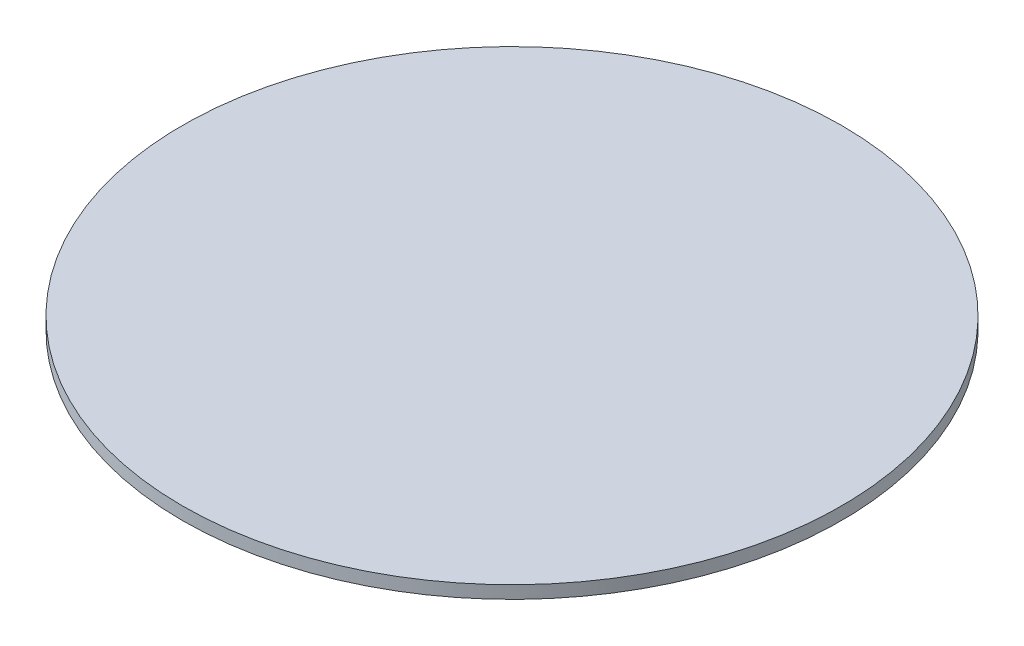
ISO-10303-21;
HEADER;
FILE_DESCRIPTION(('STEP AP214'),'2;1');
FILE_NAME('part.step','',(''),(''),'','','');
FILE_SCHEMA(('AUTOMOTIVE_DESIGN { 1 0 10303 214 1 1 1 1 }'));
ENDSEC;
DATA;
#1=APPLICATION_CONTEXT('core data for automotive mechanical design processes');
#2=APPLICATION_PROTOCOL_DEFINITION('international standard','automotive_design',2000,#1);
#3=PRODUCT_CONTEXT('',#1,'mechanical');
#4=PRODUCT('Part','Part','',(#3));
#5=PRODUCT_RELATED_PRODUCT_CATEGORY('part','',(#4));
#6=PRODUCT_DEFINITION_FORMATION('','',#4);
#7=PRODUCT_DEFINITION_CONTEXT('part definition',#1,'design');
#8=PRODUCT_DEFINITION('design','',#6,#7);
#9=PRODUCT_DEFINITION_SHAPE('','',#8);
#10=(LENGTH_UNIT() NAMED_UNIT(*) SI_UNIT(.MILLI.,.METRE.));
#11=(NAMED_UNIT(*) PLANE_ANGLE_UNIT() SI_UNIT($,.RADIAN.));
#12=(NAMED_UNIT(*) SI_UNIT($,.STERADIAN.) SOLID_ANGLE_UNIT());
#13=UNCERTAINTY_MEASURE_WITH_UNIT(LENGTH_MEASURE(1.E-05),#10,'distance_accuracy_value','');
#14=(GEOMETRIC_REPRESENTATION_CONTEXT(3) GLOBAL_UNCERTAINTY_ASSIGNED_CONTEXT((#13)) GLOBAL_UNIT_ASSIGNED_CONTEXT((#10,
#11,#12)) REPRESENTATION_CONTEXT('',''));
#15=CARTESIAN_POINT('',(0.,0.,0.));
#16=DIRECTION('',(0.,0.,1.));
#17=DIRECTION('',(1.,0.,0.));
#18=AXIS2_PLACEMENT_3D('',#15,#16,#17);
#19=CARTESIAN_POINT('',(0.,2.54,0.));
#20=DIRECTION('',(0.,-1.,0.));
#21=DIRECTION('',(0.,0.,-1.));
#22=AXIS2_PLACEMENT_3D('',#19,#20,#21);
#23=CYLINDRICAL_SURFACE('',#22,65.7697917356754);
#24=CARTESIAN_POINT('',(0.,2.54,0.));
#25=DIRECTION('',(0.,1.,0.));
#26=DIRECTION('',(0.,0.,1.));
#27=AXIS2_PLACEMENT_3D('',#24,#25,#26);
#28=CIRCLE('',#27,65.7697917356754);
#29=CARTESIAN_POINT('',(0.,2.54,65.7697917356754));
#30=VERTEX_POINT('',#29);
#31=EDGE_CURVE('E10',#30,#30,#28,.T.);
#32=ORIENTED_EDGE('',*,*,#31,.F.);
#33=EDGE_LOOP('',(#32));
#34=FACE_BOUND('',#33,.T.);
#35=CARTESIAN_POINT('',(0.,0.,0.));
#36=DIRECTION('',(0.,1.,0.));
#37=DIRECTION('',(0.,0.,1.));
#38=AXIS2_PLACEMENT_3D('',#35,#36,#37);
#39=CIRCLE('',#38,65.7697917356754);
#40=CARTESIAN_POINT('',(0.,0.,65.7697917356754));
#41=VERTEX_POINT('',#40);
#42=EDGE_CURVE('E34',#41,#41,#39,.T.);
#43=ORIENTED_EDGE('',*,*,#42,.T.);
#44=EDGE_LOOP('',(#43));
#45=FACE_BOUND('',#44,.T.);
#46=ADVANCED_FACE('F31',(#34,#45),#23,.T.);
#47=CARTESIAN_POINT('',(0.,2.54,0.));
#48=DIRECTION('',(0.,1.,0.));
#49=DIRECTION('',(0.,0.,1.));
#50=AXIS2_PLACEMENT_3D('',#47,#48,#49);
#51=PLANE('',#50);
#52=ORIENTED_EDGE('',*,*,#31,.T.);
#53=EDGE_LOOP('',(#52));
#54=FACE_BOUND('',#53,.T.);
#55=ADVANCED_FACE('F46',(#54),#51,.T.);
#56=CARTESIAN_POINT('',(0.,0.,0.));
#57=DIRECTION('',(0.,1.,0.));
#58=DIRECTION('',(0.,0.,1.));
#59=AXIS2_PLACEMENT_3D('',#56,#57,#58);
#60=PLANE('',#59);
#61=ORIENTED_EDGE('',*,*,#42,.F.);
#62=EDGE_LOOP('',(#61));
#63=FACE_BOUND('',#62,.T.);
#64=ADVANCED_FACE('F44',(#63),#60,.F.);
#65=CLOSED_SHELL('',(#46,#55,#64));
#66=MANIFOLD_SOLID_BREP('B2',#65);
#67=ADVANCED_BREP_SHAPE_REPRESENTATION('',(#18,#66),#14);
#68=SHAPE_DEFINITION_REPRESENTATION(#9,#67);
ENDSEC;
END-ISO-10303-21;
